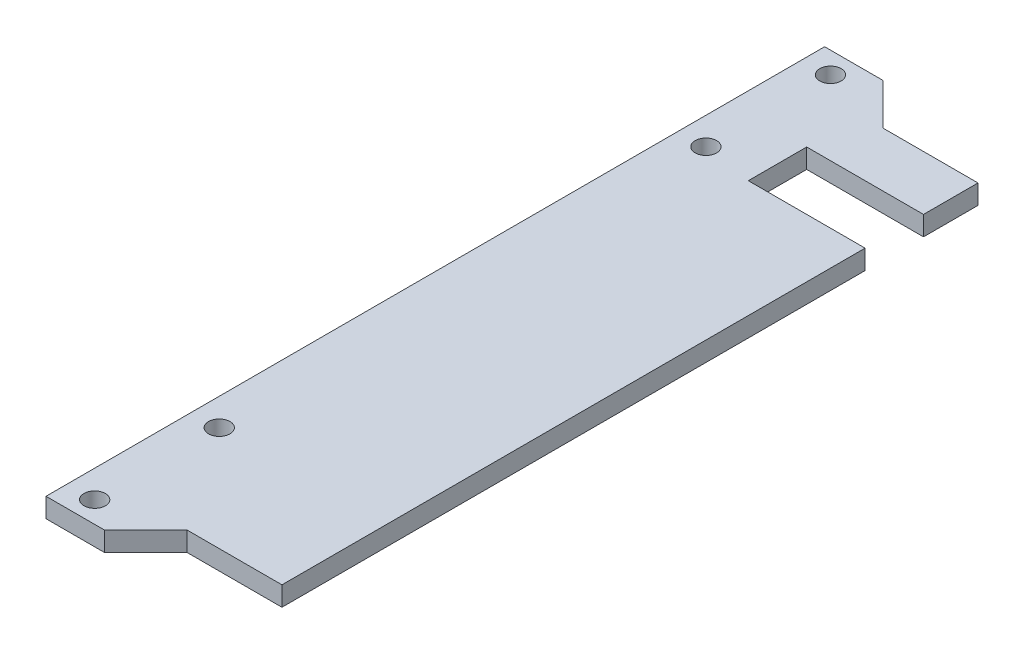
ISO-10303-21;
HEADER;
FILE_DESCRIPTION(('STEP AP214'),'2;1');
FILE_NAME('part.step','',(''),(''),'','','');
FILE_SCHEMA(('AUTOMOTIVE_DESIGN { 1 0 10303 214 1 1 1 1 }'));
ENDSEC;
DATA;
#1=APPLICATION_CONTEXT('core data for automotive mechanical design processes');
#2=APPLICATION_PROTOCOL_DEFINITION('international standard','automotive_design',2000,#1);
#3=PRODUCT_CONTEXT('',#1,'mechanical');
#4=PRODUCT('Part','Part','',(#3));
#5=PRODUCT_RELATED_PRODUCT_CATEGORY('part','',(#4));
#6=PRODUCT_DEFINITION_FORMATION('','',#4);
#7=PRODUCT_DEFINITION_CONTEXT('part definition',#1,'design');
#8=PRODUCT_DEFINITION('design','',#6,#7);
#9=PRODUCT_DEFINITION_SHAPE('','',#8);
#10=(LENGTH_UNIT() NAMED_UNIT(*) SI_UNIT(.MILLI.,.METRE.));
#11=(NAMED_UNIT(*) PLANE_ANGLE_UNIT() SI_UNIT($,.RADIAN.));
#12=(NAMED_UNIT(*) SI_UNIT($,.STERADIAN.) SOLID_ANGLE_UNIT());
#13=UNCERTAINTY_MEASURE_WITH_UNIT(LENGTH_MEASURE(1.E-05),#10,'distance_accuracy_value','');
#14=(GEOMETRIC_REPRESENTATION_CONTEXT(3) GLOBAL_UNCERTAINTY_ASSIGNED_CONTEXT((#13)) GLOBAL_UNIT_ASSIGNED_CONTEXT((#10,
#11,#12)) REPRESENTATION_CONTEXT('',''));
#15=CARTESIAN_POINT('',(0.,0.,0.));
#16=DIRECTION('',(0.,0.,1.));
#17=DIRECTION('',(1.,0.,0.));
#18=AXIS2_PLACEMENT_3D('',#15,#16,#17);
#19=CARTESIAN_POINT('',(50.,5.,89.3933982822019));
#20=DIRECTION('',(-1.,0.,0.));
#21=DIRECTION('',(0.,0.,1.));
#22=AXIS2_PLACEMENT_3D('',#19,#20,#21);
#23=PLANE('',#22);
#24=DIRECTION('',(0.,0.,-1.));
#25=VECTOR('',#24,1.);
#26=CARTESIAN_POINT('',(50.,0.,89.3933982822019));
#27=LINE('',#26,#25);
#28=CARTESIAN_POINT('',(50.,0.,89.3933982822019));
#29=VERTEX_POINT('',#28);
#30=CARTESIAN_POINT('',(50.,0.,-60.3933982822019));
#31=VERTEX_POINT('',#30);
#32=EDGE_CURVE('E171',#29,#31,#27,.T.);
#33=ORIENTED_EDGE('',*,*,#32,.T.);
#34=DIRECTION('',(0.,1.,0.));
#35=VECTOR('',#34,1.);
#36=CARTESIAN_POINT('',(50.,0.,-60.3933982822019));
#37=LINE('',#36,#35);
#38=CARTESIAN_POINT('',(50.,5.,-60.3933982822019));
#39=VERTEX_POINT('',#38);
#40=EDGE_CURVE('E221',#31,#39,#37,.T.);
#41=ORIENTED_EDGE('',*,*,#40,.T.);
#42=DIRECTION('',(0.,0.,-1.));
#43=VECTOR('',#42,1.);
#44=CARTESIAN_POINT('',(50.,5.,89.3933982822019));
#45=LINE('',#44,#43);
#46=CARTESIAN_POINT('',(50.,5.,89.3933982822019));
#47=VERTEX_POINT('',#46);
#48=EDGE_CURVE('E135',#47,#39,#45,.T.);
#49=ORIENTED_EDGE('',*,*,#48,.F.);
#50=DIRECTION('',(0.,-1.,0.));
#51=VECTOR('',#50,1.);
#52=CARTESIAN_POINT('',(50.,5.,89.3933982822019));
#53=LINE('',#52,#51);
#54=EDGE_CURVE('E189',#47,#29,#53,.T.);
#55=ORIENTED_EDGE('',*,*,#54,.T.);
#56=EDGE_LOOP('',(#33,#41,#49,#55));
#57=FACE_BOUND('',#56,.T.);
#58=ADVANCED_FACE('F38',(#57),#23,.F.);
#59=CARTESIAN_POINT('',(0.,5.,0.));
#60=DIRECTION('',(0.,1.,0.));
#61=DIRECTION('',(0.,0.,1.));
#62=AXIS2_PLACEMENT_3D('',#59,#60,#61);
#63=PLANE('',#62);
#64=DIRECTION('',(1.,0.,0.));
#65=VECTOR('',#64,1.);
#66=CARTESIAN_POINT('',(20.,5.,-60.3933982822019));
#67=LINE('',#66,#65);
#68=CARTESIAN_POINT('',(20.,5.,-60.3933982822019));
#69=VERTEX_POINT('',#68);
#70=EDGE_CURVE('E279',#69,#39,#67,.T.);
#71=ORIENTED_EDGE('',*,*,#70,.F.);
#72=DIRECTION('',(0.,0.,1.));
#73=VECTOR('',#72,1.);
#74=CARTESIAN_POINT('',(20.,5.,-75.3933982822019));
#75=LINE('',#74,#73);
#76=CARTESIAN_POINT('',(20.,5.,-75.3933982822019));
#77=VERTEX_POINT('',#76);
#78=EDGE_CURVE('E283',#77,#69,#75,.T.);
#79=ORIENTED_EDGE('',*,*,#78,.F.);
#80=DIRECTION('',(-1.,0.,0.));
#81=VECTOR('',#80,1.);
#82=CARTESIAN_POINT('',(50.,5.,-75.3933982822019));
#83=LINE('',#82,#81);
#84=CARTESIAN_POINT('',(50.,5.,-75.3933982822019));
#85=VERTEX_POINT('',#84);
#86=EDGE_CURVE('E287',#85,#77,#83,.T.);
#87=ORIENTED_EDGE('',*,*,#86,.F.);
#88=CARTESIAN_POINT('',(50.,5.,-89.3933982822019));
#89=VERTEX_POINT('',#88);
#90=EDGE_CURVE('E130',#85,#89,#45,.T.);
#91=ORIENTED_EDGE('',*,*,#90,.T.);
#92=DIRECTION('',(-1.,0.,0.));
#93=VECTOR('',#92,1.);
#94=CARTESIAN_POINT('',(25.6066017177984,5.,-89.3933982822019));
#95=LINE('',#94,#93);
#96=CARTESIAN_POINT('',(25.6066017177984,5.,-89.3933982822019));
#97=VERTEX_POINT('',#96);
#98=EDGE_CURVE('E120',#89,#97,#95,.T.);
#99=ORIENTED_EDGE('',*,*,#98,.T.);
#100=DIRECTION('',(-0.707106781186557,0.,-0.707106781186538));
#101=VECTOR('',#100,1.);
#102=CARTESIAN_POINT('',(15.,5.,-100.));
#103=LINE('',#102,#101);
#104=CARTESIAN_POINT('',(15.,5.,-100.));
#105=VERTEX_POINT('',#104);
#106=EDGE_CURVE('E126',#97,#105,#103,.T.);
#107=ORIENTED_EDGE('',*,*,#106,.T.);
#108=DIRECTION('',(-1.,0.,0.));
#109=VECTOR('',#108,1.);
#110=CARTESIAN_POINT('',(0.,5.,-100.));
#111=LINE('',#110,#109);
#112=CARTESIAN_POINT('',(0.,5.,-100.));
#113=VERTEX_POINT('',#112);
#114=EDGE_CURVE('E63',#105,#113,#111,.T.);
#115=ORIENTED_EDGE('',*,*,#114,.T.);
#116=DIRECTION('',(0.,0.,1.));
#117=VECTOR('',#116,1.);
#118=CARTESIAN_POINT('',(0.,5.,-100.));
#119=LINE('',#118,#117);
#120=CARTESIAN_POINT('',(0.,5.,100.));
#121=VERTEX_POINT('',#120);
#122=EDGE_CURVE('E182',#113,#121,#119,.T.);
#123=ORIENTED_EDGE('',*,*,#122,.T.);
#124=DIRECTION('',(1.,0.,0.));
#125=VECTOR('',#124,1.);
#126=CARTESIAN_POINT('',(0.,5.,100.));
#127=LINE('',#126,#125);
#128=CARTESIAN_POINT('',(15.,5.,100.));
#129=VERTEX_POINT('',#128);
#130=EDGE_CURVE('E104',#121,#129,#127,.T.);
#131=ORIENTED_EDGE('',*,*,#130,.T.);
#132=DIRECTION('',(0.707106781186556,0.,-0.707106781186538));
#133=VECTOR('',#132,1.);
#134=CARTESIAN_POINT('',(15.,5.,100.));
#135=LINE('',#134,#133);
#136=CARTESIAN_POINT('',(25.6066017177984,5.,89.3933982822019));
#137=VERTEX_POINT('',#136);
#138=EDGE_CURVE('E203',#129,#137,#135,.T.);
#139=ORIENTED_EDGE('',*,*,#138,.T.);
#140=DIRECTION('',(1.,0.,0.));
#141=VECTOR('',#140,1.);
#142=CARTESIAN_POINT('',(25.6066017177984,5.,89.3933982822019));
#143=LINE('',#142,#141);
#144=EDGE_CURVE('E224',#137,#47,#143,.T.);
#145=ORIENTED_EDGE('',*,*,#144,.T.);
#146=ORIENTED_EDGE('',*,*,#48,.T.);
#147=EDGE_LOOP('',(#71,#79,#87,#91,#99,#107,#115,#123,#131,#139,#145,#146));
#148=FACE_BOUND('',#147,.T.);
#149=CARTESIAN_POINT('',(7.00000000000001,5.,62.5));
#150=DIRECTION('',(0.,1.,0.));
#151=DIRECTION('',(0.,0.,-1.));
#152=AXIS2_PLACEMENT_3D('',#149,#150,#151);
#153=CIRCLE('',#152,2.75);
#154=CARTESIAN_POINT('',(7.00000000000001,5.,59.75));
#155=VERTEX_POINT('',#154);
#156=EDGE_CURVE('E246',#155,#155,#153,.T.);
#157=ORIENTED_EDGE('',*,*,#156,.F.);
#158=EDGE_LOOP('',(#157));
#159=FACE_BOUND('',#158,.T.);
#160=CARTESIAN_POINT('',(7.,5.,-94.5));
#161=DIRECTION('',(0.,1.,0.));
#162=DIRECTION('',(0.,0.,1.));
#163=AXIS2_PLACEMENT_3D('',#160,#161,#162);
#164=CIRCLE('',#163,2.75);
#165=CARTESIAN_POINT('',(7.,5.,-91.75));
#166=VERTEX_POINT('',#165);
#167=EDGE_CURVE('E161',#166,#166,#164,.T.);
#168=ORIENTED_EDGE('',*,*,#167,.F.);
#169=EDGE_LOOP('',(#168));
#170=FACE_BOUND('',#169,.T.);
#171=CARTESIAN_POINT('',(7.00000000000001,5.,-62.5));
#172=DIRECTION('',(0.,1.,0.));
#173=DIRECTION('',(0.,0.,1.));
#174=AXIS2_PLACEMENT_3D('',#171,#172,#173);
#175=CIRCLE('',#174,2.75);
#176=CARTESIAN_POINT('',(7.00000000000001,5.,-59.75));
#177=VERTEX_POINT('',#176);
#178=EDGE_CURVE('E238',#177,#177,#175,.T.);
#179=ORIENTED_EDGE('',*,*,#178,.F.);
#180=EDGE_LOOP('',(#179));
#181=FACE_BOUND('',#180,.T.);
#182=CARTESIAN_POINT('',(7.,5.,94.5));
#183=DIRECTION('',(0.,1.,0.));
#184=DIRECTION('',(0.,0.,-1.));
#185=AXIS2_PLACEMENT_3D('',#182,#183,#184);
#186=CIRCLE('',#185,2.75);
#187=CARTESIAN_POINT('',(7.,5.,91.75));
#188=VERTEX_POINT('',#187);
#189=EDGE_CURVE('E254',#188,#188,#186,.T.);
#190=ORIENTED_EDGE('',*,*,#189,.F.);
#191=EDGE_LOOP('',(#190));
#192=FACE_BOUND('',#191,.T.);
#193=ADVANCED_FACE('F123',(#148,#159,#170,#181,#192),#63,.T.);
#194=CARTESIAN_POINT('',(0.,0.,0.));
#195=DIRECTION('',(0.,1.,0.));
#196=DIRECTION('',(0.,0.,1.));
#197=AXIS2_PLACEMENT_3D('',#194,#195,#196);
#198=PLANE('',#197);
#199=DIRECTION('',(0.,0.,1.));
#200=VECTOR('',#199,1.);
#201=CARTESIAN_POINT('',(20.,0.,-75.3933982822019));
#202=LINE('',#201,#200);
#203=CARTESIAN_POINT('',(20.,0.,-75.3933982822019));
#204=VERTEX_POINT('',#203);
#205=CARTESIAN_POINT('',(20.,0.,-60.3933982822019));
#206=VERTEX_POINT('',#205);
#207=EDGE_CURVE('E293',#204,#206,#202,.T.);
#208=ORIENTED_EDGE('',*,*,#207,.T.);
#209=DIRECTION('',(1.,0.,0.));
#210=VECTOR('',#209,1.);
#211=CARTESIAN_POINT('',(20.,0.,-60.3933982822019));
#212=LINE('',#211,#210);
#213=EDGE_CURVE('E269',#206,#31,#212,.T.);
#214=ORIENTED_EDGE('',*,*,#213,.T.);
#215=ORIENTED_EDGE('',*,*,#32,.F.);
#216=DIRECTION('',(1.,0.,0.));
#217=VECTOR('',#216,1.);
#218=CARTESIAN_POINT('',(25.6066017177984,0.,89.3933982822019));
#219=LINE('',#218,#217);
#220=CARTESIAN_POINT('',(25.6066017177984,0.,89.3933982822019));
#221=VERTEX_POINT('',#220);
#222=EDGE_CURVE('E167',#221,#29,#219,.T.);
#223=ORIENTED_EDGE('',*,*,#222,.F.);
#224=DIRECTION('',(0.707106781186556,0.,-0.707106781186538));
#225=VECTOR('',#224,1.);
#226=CARTESIAN_POINT('',(15.,0.,100.));
#227=LINE('',#226,#225);
#228=CARTESIAN_POINT('',(15.,0.,100.));
#229=VERTEX_POINT('',#228);
#230=EDGE_CURVE('E164',#229,#221,#227,.T.);
#231=ORIENTED_EDGE('',*,*,#230,.F.);
#232=DIRECTION('',(1.,0.,0.));
#233=VECTOR('',#232,1.);
#234=CARTESIAN_POINT('',(0.,0.,100.));
#235=LINE('',#234,#233);
#236=CARTESIAN_POINT('',(0.,0.,100.));
#237=VERTEX_POINT('',#236);
#238=EDGE_CURVE('E160',#237,#229,#235,.T.);
#239=ORIENTED_EDGE('',*,*,#238,.F.);
#240=DIRECTION('',(0.,0.,1.));
#241=VECTOR('',#240,1.);
#242=CARTESIAN_POINT('',(0.,0.,-100.));
#243=LINE('',#242,#241);
#244=CARTESIAN_POINT('',(0.,0.,-100.));
#245=VERTEX_POINT('',#244);
#246=EDGE_CURVE('E156',#245,#237,#243,.T.);
#247=ORIENTED_EDGE('',*,*,#246,.F.);
#248=DIRECTION('',(-1.,0.,0.));
#249=VECTOR('',#248,1.);
#250=CARTESIAN_POINT('',(0.,0.,-100.));
#251=LINE('',#250,#249);
#252=CARTESIAN_POINT('',(15.,0.,-100.));
#253=VERTEX_POINT('',#252);
#254=EDGE_CURVE('E96',#253,#245,#251,.T.);
#255=ORIENTED_EDGE('',*,*,#254,.F.);
#256=DIRECTION('',(-0.707106781186557,0.,-0.707106781186538));
#257=VECTOR('',#256,1.);
#258=CARTESIAN_POINT('',(15.,0.,-100.));
#259=LINE('',#258,#257);
#260=CARTESIAN_POINT('',(25.6066017177984,0.,-89.3933982822019));
#261=VERTEX_POINT('',#260);
#262=EDGE_CURVE('E177',#261,#253,#259,.T.);
#263=ORIENTED_EDGE('',*,*,#262,.F.);
#264=DIRECTION('',(-1.,0.,0.));
#265=VECTOR('',#264,1.);
#266=CARTESIAN_POINT('',(25.6066017177984,0.,-89.3933982822019));
#267=LINE('',#266,#265);
#268=CARTESIAN_POINT('',(50.,0.,-89.3933982822019));
#269=VERTEX_POINT('',#268);
#270=EDGE_CURVE('E141',#269,#261,#267,.T.);
#271=ORIENTED_EDGE('',*,*,#270,.F.);
#272=CARTESIAN_POINT('',(50.,0.,-75.3933982822019));
#273=VERTEX_POINT('',#272);
#274=EDGE_CURVE('E170',#273,#269,#27,.T.);
#275=ORIENTED_EDGE('',*,*,#274,.F.);
#276=DIRECTION('',(-1.,0.,0.));
#277=VECTOR('',#276,1.);
#278=CARTESIAN_POINT('',(50.,0.,-75.3933982822019));
#279=LINE('',#278,#277);
#280=EDGE_CURVE('E54',#273,#204,#279,.T.);
#281=ORIENTED_EDGE('',*,*,#280,.T.);
#282=EDGE_LOOP('',(#208,#214,#215,#223,#231,#239,#247,#255,#263,#271,#275,#281));
#283=FACE_BOUND('',#282,.T.);
#284=CARTESIAN_POINT('',(7.,0.,-94.5));
#285=DIRECTION('',(0.,1.,0.));
#286=DIRECTION('',(0.,0.,1.));
#287=AXIS2_PLACEMENT_3D('',#284,#285,#286);
#288=CIRCLE('',#287,2.75);
#289=CARTESIAN_POINT('',(7.,0.,-91.75));
#290=VERTEX_POINT('',#289);
#291=EDGE_CURVE('E234',#290,#290,#288,.T.);
#292=ORIENTED_EDGE('',*,*,#291,.T.);
#293=EDGE_LOOP('',(#292));
#294=FACE_BOUND('',#293,.T.);
#295=CARTESIAN_POINT('',(7.00000000000001,0.,-62.5));
#296=DIRECTION('',(0.,1.,0.));
#297=DIRECTION('',(0.,0.,1.));
#298=AXIS2_PLACEMENT_3D('',#295,#296,#297);
#299=CIRCLE('',#298,2.75);
#300=CARTESIAN_POINT('',(7.00000000000001,0.,-59.75));
#301=VERTEX_POINT('',#300);
#302=EDGE_CURVE('E242',#301,#301,#299,.T.);
#303=ORIENTED_EDGE('',*,*,#302,.T.);
#304=EDGE_LOOP('',(#303));
#305=FACE_BOUND('',#304,.T.);
#306=CARTESIAN_POINT('',(7.00000000000001,0.,62.5));
#307=DIRECTION('',(0.,1.,0.));
#308=DIRECTION('',(0.,0.,-1.));
#309=AXIS2_PLACEMENT_3D('',#306,#307,#308);
#310=CIRCLE('',#309,2.75);
#311=CARTESIAN_POINT('',(7.00000000000001,0.,59.75));
#312=VERTEX_POINT('',#311);
#313=EDGE_CURVE('E250',#312,#312,#310,.T.);
#314=ORIENTED_EDGE('',*,*,#313,.T.);
#315=EDGE_LOOP('',(#314));
#316=FACE_BOUND('',#315,.T.);
#317=CARTESIAN_POINT('',(7.,0.,94.5));
#318=DIRECTION('',(0.,1.,0.));
#319=DIRECTION('',(0.,0.,-1.));
#320=AXIS2_PLACEMENT_3D('',#317,#318,#319);
#321=CIRCLE('',#320,2.75);
#322=CARTESIAN_POINT('',(7.,0.,91.75));
#323=VERTEX_POINT('',#322);
#324=EDGE_CURVE('E258',#323,#323,#321,.T.);
#325=ORIENTED_EDGE('',*,*,#324,.T.);
#326=EDGE_LOOP('',(#325));
#327=FACE_BOUND('',#326,.T.);
#328=ADVANCED_FACE('F207',(#283,#294,#305,#316,#327),#198,.F.);
#329=CARTESIAN_POINT('',(0.,5.,-100.));
#330=DIRECTION('',(1.,0.,0.));
#331=DIRECTION('',(0.,0.,-1.));
#332=AXIS2_PLACEMENT_3D('',#329,#330,#331);
#333=PLANE('',#332);
#334=ORIENTED_EDGE('',*,*,#246,.T.);
#335=DIRECTION('',(0.,-1.,0.));
#336=VECTOR('',#335,1.);
#337=CARTESIAN_POINT('',(0.,5.,100.));
#338=LINE('',#337,#336);
#339=EDGE_CURVE('E11',#121,#237,#338,.T.);
#340=ORIENTED_EDGE('',*,*,#339,.F.);
#341=ORIENTED_EDGE('',*,*,#122,.F.);
#342=DIRECTION('',(0.,-1.,0.));
#343=VECTOR('',#342,1.);
#344=CARTESIAN_POINT('',(0.,5.,-100.));
#345=LINE('',#344,#343);
#346=EDGE_CURVE('E152',#113,#245,#345,.T.);
#347=ORIENTED_EDGE('',*,*,#346,.T.);
#348=EDGE_LOOP('',(#334,#340,#341,#347));
#349=FACE_BOUND('',#348,.T.);
#350=ADVANCED_FACE('F40',(#349),#333,.F.);
#351=CARTESIAN_POINT('',(0.,5.,100.));
#352=DIRECTION('',(0.,0.,-1.));
#353=DIRECTION('',(-1.,0.,0.));
#354=AXIS2_PLACEMENT_3D('',#351,#352,#353);
#355=PLANE('',#354);
#356=ORIENTED_EDGE('',*,*,#238,.T.);
#357=DIRECTION('',(0.,-1.,0.));
#358=VECTOR('',#357,1.);
#359=CARTESIAN_POINT('',(15.,5.,100.));
#360=LINE('',#359,#358);
#361=EDGE_CURVE('E47',#129,#229,#360,.T.);
#362=ORIENTED_EDGE('',*,*,#361,.F.);
#363=ORIENTED_EDGE('',*,*,#130,.F.);
#364=ORIENTED_EDGE('',*,*,#339,.T.);
#365=EDGE_LOOP('',(#356,#362,#363,#364));
#366=FACE_BOUND('',#365,.T.);
#367=ADVANCED_FACE('F322',(#366),#355,.F.);
#368=CARTESIAN_POINT('',(15.,5.,100.));
#369=DIRECTION('',(-0.707106781186538,0.,-0.707106781186556));
#370=DIRECTION('',(-0.707106781186557,0.,0.707106781186539));
#371=AXIS2_PLACEMENT_3D('',#368,#369,#370);
#372=PLANE('',#371);
#373=ORIENTED_EDGE('',*,*,#230,.T.);
#374=DIRECTION('',(0.,-1.,0.));
#375=VECTOR('',#374,1.);
#376=CARTESIAN_POINT('',(25.6066017177984,5.,89.3933982822019));
#377=LINE('',#376,#375);
#378=EDGE_CURVE('E193',#137,#221,#377,.T.);
#379=ORIENTED_EDGE('',*,*,#378,.F.);
#380=ORIENTED_EDGE('',*,*,#138,.F.);
#381=ORIENTED_EDGE('',*,*,#361,.T.);
#382=EDGE_LOOP('',(#373,#379,#380,#381));
#383=FACE_BOUND('',#382,.T.);
#384=ADVANCED_FACE('F201',(#383),#372,.F.);
#385=CARTESIAN_POINT('',(25.6066017177984,5.,89.3933982822019));
#386=DIRECTION('',(0.,0.,-1.));
#387=DIRECTION('',(-1.,0.,0.));
#388=AXIS2_PLACEMENT_3D('',#385,#386,#387);
#389=PLANE('',#388);
#390=ORIENTED_EDGE('',*,*,#222,.T.);
#391=ORIENTED_EDGE('',*,*,#54,.F.);
#392=ORIENTED_EDGE('',*,*,#144,.F.);
#393=ORIENTED_EDGE('',*,*,#378,.T.);
#394=EDGE_LOOP('',(#390,#391,#392,#393));
#395=FACE_BOUND('',#394,.T.);
#396=ADVANCED_FACE('F214',(#395),#389,.F.);
#397=ORIENTED_EDGE('',*,*,#90,.F.);
#398=DIRECTION('',(0.,1.,0.));
#399=VECTOR('',#398,1.);
#400=CARTESIAN_POINT('',(50.,0.,-75.3933982822019));
#401=LINE('',#400,#399);
#402=EDGE_CURVE('E265',#273,#85,#401,.T.);
#403=ORIENTED_EDGE('',*,*,#402,.F.);
#404=ORIENTED_EDGE('',*,*,#274,.T.);
#405=DIRECTION('',(0.,-1.,0.));
#406=VECTOR('',#405,1.);
#407=CARTESIAN_POINT('',(50.,5.,-89.3933982822019));
#408=LINE('',#407,#406);
#409=EDGE_CURVE('E145',#89,#269,#408,.T.);
#410=ORIENTED_EDGE('',*,*,#409,.F.);
#411=EDGE_LOOP('',(#397,#403,#404,#410));
#412=FACE_BOUND('',#411,.T.);
#413=ADVANCED_FACE('F317',(#412),#23,.F.);
#414=CARTESIAN_POINT('',(25.6066017177984,5.,-89.3933982822019));
#415=DIRECTION('',(0.,0.,1.));
#416=DIRECTION('',(1.,0.,0.));
#417=AXIS2_PLACEMENT_3D('',#414,#415,#416);
#418=PLANE('',#417);
#419=ORIENTED_EDGE('',*,*,#270,.T.);
#420=DIRECTION('',(0.,-1.,0.));
#421=VECTOR('',#420,1.);
#422=CARTESIAN_POINT('',(25.6066017177984,5.,-89.3933982822019));
#423=LINE('',#422,#421);
#424=EDGE_CURVE('E138',#97,#261,#423,.T.);
#425=ORIENTED_EDGE('',*,*,#424,.F.);
#426=ORIENTED_EDGE('',*,*,#98,.F.);
#427=ORIENTED_EDGE('',*,*,#409,.T.);
#428=EDGE_LOOP('',(#419,#425,#426,#427));
#429=FACE_BOUND('',#428,.T.);
#430=ADVANCED_FACE('F139',(#429),#418,.F.);
#431=CARTESIAN_POINT('',(15.,5.,-100.));
#432=DIRECTION('',(-0.707106781186538,0.,0.707106781186557));
#433=DIRECTION('',(0.707106781186557,0.,0.707106781186538));
#434=AXIS2_PLACEMENT_3D('',#431,#432,#433);
#435=PLANE('',#434);
#436=ORIENTED_EDGE('',*,*,#262,.T.);
#437=DIRECTION('',(0.,-1.,0.));
#438=VECTOR('',#437,1.);
#439=CARTESIAN_POINT('',(15.,5.,-100.));
#440=LINE('',#439,#438);
#441=EDGE_CURVE('E146',#105,#253,#440,.T.);
#442=ORIENTED_EDGE('',*,*,#441,.F.);
#443=ORIENTED_EDGE('',*,*,#106,.F.);
#444=ORIENTED_EDGE('',*,*,#424,.T.);
#445=EDGE_LOOP('',(#436,#442,#443,#444));
#446=FACE_BOUND('',#445,.T.);
#447=ADVANCED_FACE('F148',(#446),#435,.F.);
#448=CARTESIAN_POINT('',(0.,5.,-100.));
#449=DIRECTION('',(0.,0.,1.));
#450=DIRECTION('',(1.,0.,0.));
#451=AXIS2_PLACEMENT_3D('',#448,#449,#450);
#452=PLANE('',#451);
#453=ORIENTED_EDGE('',*,*,#254,.T.);
#454=ORIENTED_EDGE('',*,*,#346,.F.);
#455=ORIENTED_EDGE('',*,*,#114,.F.);
#456=ORIENTED_EDGE('',*,*,#441,.T.);
#457=EDGE_LOOP('',(#453,#454,#455,#456));
#458=FACE_BOUND('',#457,.T.);
#459=ADVANCED_FACE('F318',(#458),#452,.F.);
#460=CARTESIAN_POINT('',(7.,5.,-94.5));
#461=DIRECTION('',(0.,-1.,0.));
#462=DIRECTION('',(0.,0.,-1.));
#463=AXIS2_PLACEMENT_3D('',#460,#461,#462);
#464=CYLINDRICAL_SURFACE('',#463,2.75);
#465=ORIENTED_EDGE('',*,*,#167,.T.);
#466=EDGE_LOOP('',(#465));
#467=FACE_BOUND('',#466,.T.);
#468=ORIENTED_EDGE('',*,*,#291,.F.);
#469=EDGE_LOOP('',(#468));
#470=FACE_BOUND('',#469,.T.);
#471=ADVANCED_FACE('F369',(#467,#470),#464,.F.);
#472=CARTESIAN_POINT('',(7.00000000000001,5.,-62.5));
#473=DIRECTION('',(0.,-1.,0.));
#474=DIRECTION('',(0.,0.,-1.));
#475=AXIS2_PLACEMENT_3D('',#472,#473,#474);
#476=CYLINDRICAL_SURFACE('',#475,2.75);
#477=ORIENTED_EDGE('',*,*,#178,.T.);
#478=EDGE_LOOP('',(#477));
#479=FACE_BOUND('',#478,.T.);
#480=ORIENTED_EDGE('',*,*,#302,.F.);
#481=EDGE_LOOP('',(#480));
#482=FACE_BOUND('',#481,.T.);
#483=ADVANCED_FACE('F376',(#479,#482),#476,.F.);
#484=CARTESIAN_POINT('',(7.00000000000001,5.,62.5));
#485=DIRECTION('',(0.,-1.,0.));
#486=DIRECTION('',(0.,0.,-1.));
#487=AXIS2_PLACEMENT_3D('',#484,#485,#486);
#488=CYLINDRICAL_SURFACE('',#487,2.75);
#489=ORIENTED_EDGE('',*,*,#156,.T.);
#490=EDGE_LOOP('',(#489));
#491=FACE_BOUND('',#490,.T.);
#492=ORIENTED_EDGE('',*,*,#313,.F.);
#493=EDGE_LOOP('',(#492));
#494=FACE_BOUND('',#493,.T.);
#495=ADVANCED_FACE('F384',(#491,#494),#488,.F.);
#496=CARTESIAN_POINT('',(7.,5.,94.5));
#497=DIRECTION('',(0.,-1.,0.));
#498=DIRECTION('',(0.,0.,-1.));
#499=AXIS2_PLACEMENT_3D('',#496,#497,#498);
#500=CYLINDRICAL_SURFACE('',#499,2.75);
#501=ORIENTED_EDGE('',*,*,#189,.T.);
#502=EDGE_LOOP('',(#501));
#503=FACE_BOUND('',#502,.T.);
#504=ORIENTED_EDGE('',*,*,#324,.F.);
#505=EDGE_LOOP('',(#504));
#506=FACE_BOUND('',#505,.T.);
#507=ADVANCED_FACE('F392',(#503,#506),#500,.F.);
#508=CARTESIAN_POINT('',(20.,0.,-60.3933982822019));
#509=DIRECTION('',(0.,0.,1.));
#510=DIRECTION('',(1.,0.,0.));
#511=AXIS2_PLACEMENT_3D('',#508,#509,#510);
#512=PLANE('',#511);
#513=ORIENTED_EDGE('',*,*,#70,.T.);
#514=ORIENTED_EDGE('',*,*,#40,.F.);
#515=ORIENTED_EDGE('',*,*,#213,.F.);
#516=DIRECTION('',(0.,1.,0.));
#517=VECTOR('',#516,1.);
#518=CARTESIAN_POINT('',(20.,0.,-60.3933982822019));
#519=LINE('',#518,#517);
#520=EDGE_CURVE('E273',#206,#69,#519,.T.);
#521=ORIENTED_EDGE('',*,*,#520,.T.);
#522=EDGE_LOOP('',(#513,#514,#515,#521));
#523=FACE_BOUND('',#522,.T.);
#524=ADVANCED_FACE('F312',(#523),#512,.F.);
#525=CARTESIAN_POINT('',(20.,0.,-75.3933982822019));
#526=DIRECTION('',(-1.,0.,0.));
#527=DIRECTION('',(0.,0.,1.));
#528=AXIS2_PLACEMENT_3D('',#525,#526,#527);
#529=PLANE('',#528);
#530=ORIENTED_EDGE('',*,*,#78,.T.);
#531=ORIENTED_EDGE('',*,*,#520,.F.);
#532=ORIENTED_EDGE('',*,*,#207,.F.);
#533=DIRECTION('',(0.,1.,0.));
#534=VECTOR('',#533,1.);
#535=CARTESIAN_POINT('',(20.,0.,-75.3933982822019));
#536=LINE('',#535,#534);
#537=EDGE_CURVE('E268',#204,#77,#536,.T.);
#538=ORIENTED_EDGE('',*,*,#537,.T.);
#539=EDGE_LOOP('',(#530,#531,#532,#538));
#540=FACE_BOUND('',#539,.T.);
#541=ADVANCED_FACE('F315',(#540),#529,.F.);
#542=CARTESIAN_POINT('',(50.,0.,-75.3933982822019));
#543=DIRECTION('',(0.,0.,-1.));
#544=DIRECTION('',(-1.,0.,0.));
#545=AXIS2_PLACEMENT_3D('',#542,#543,#544);
#546=PLANE('',#545);
#547=ORIENTED_EDGE('',*,*,#86,.T.);
#548=ORIENTED_EDGE('',*,*,#537,.F.);
#549=ORIENTED_EDGE('',*,*,#280,.F.);
#550=ORIENTED_EDGE('',*,*,#402,.T.);
#551=EDGE_LOOP('',(#547,#548,#549,#550));
#552=FACE_BOUND('',#551,.T.);
#553=ADVANCED_FACE('F415',(#552),#546,.F.);
#554=CLOSED_SHELL('',(#58,#193,#328,#350,#367,#384,#396,#413,#430,#447,#459,#471,#483,#495,#507,
#524,#541,#553));
#555=MANIFOLD_SOLID_BREP('B2',#554);
#556=ADVANCED_BREP_SHAPE_REPRESENTATION('',(#18,#555),#14);
#557=SHAPE_DEFINITION_REPRESENTATION(#9,#556);
ENDSEC;
END-ISO-10303-21;
